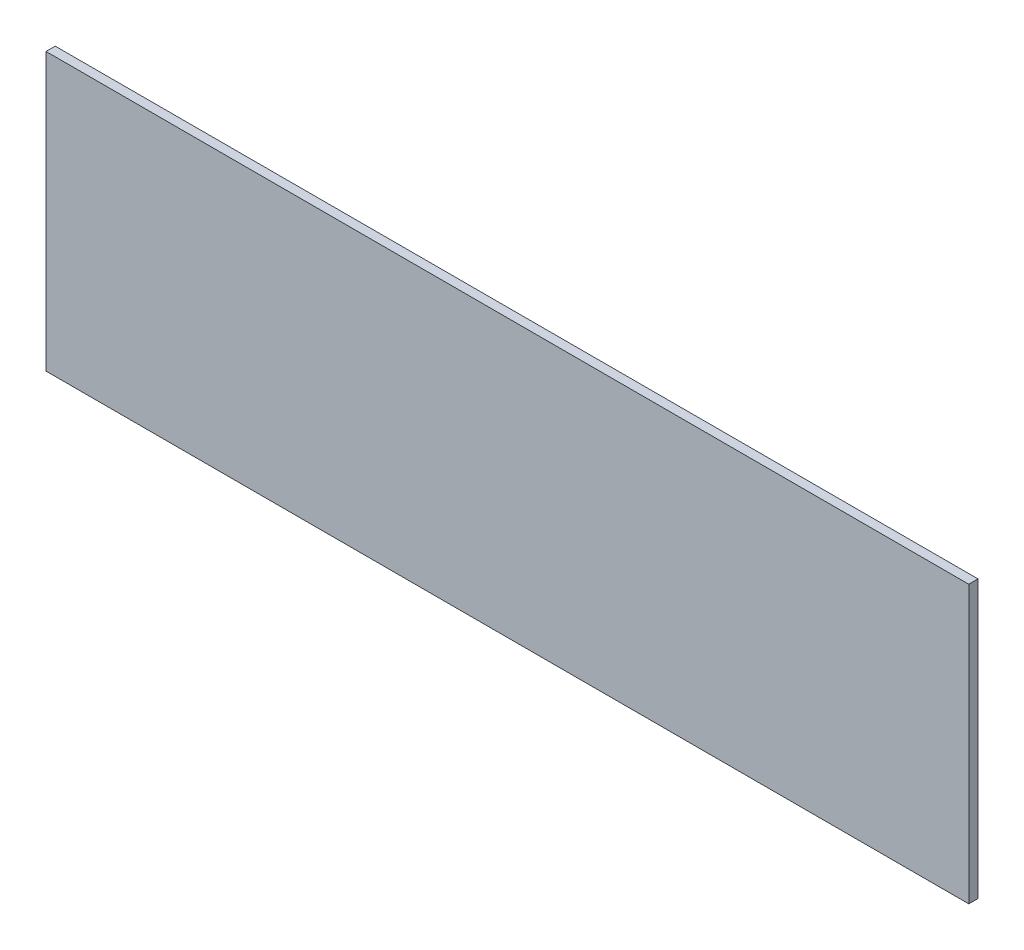
ISO-10303-21;
HEADER;
FILE_DESCRIPTION(('STEP AP214'),'2;1');
FILE_NAME('part.step','',(''),(''),'','','');
FILE_SCHEMA(('AUTOMOTIVE_DESIGN { 1 0 10303 214 1 1 1 1 }'));
ENDSEC;
DATA;
#1=APPLICATION_CONTEXT('core data for automotive mechanical design processes');
#2=APPLICATION_PROTOCOL_DEFINITION('international standard','automotive_design',2000,#1);
#3=PRODUCT_CONTEXT('',#1,'mechanical');
#4=PRODUCT('Part','Part','',(#3));
#5=PRODUCT_RELATED_PRODUCT_CATEGORY('part','',(#4));
#6=PRODUCT_DEFINITION_FORMATION('','',#4);
#7=PRODUCT_DEFINITION_CONTEXT('part definition',#1,'design');
#8=PRODUCT_DEFINITION('design','',#6,#7);
#9=PRODUCT_DEFINITION_SHAPE('','',#8);
#10=(LENGTH_UNIT() NAMED_UNIT(*) SI_UNIT(.MILLI.,.METRE.));
#11=(NAMED_UNIT(*) PLANE_ANGLE_UNIT() SI_UNIT($,.RADIAN.));
#12=(NAMED_UNIT(*) SI_UNIT($,.STERADIAN.) SOLID_ANGLE_UNIT());
#13=UNCERTAINTY_MEASURE_WITH_UNIT(LENGTH_MEASURE(1.E-05),#10,'distance_accuracy_value','');
#14=(GEOMETRIC_REPRESENTATION_CONTEXT(3) GLOBAL_UNCERTAINTY_ASSIGNED_CONTEXT((#13)) GLOBAL_UNIT_ASSIGNED_CONTEXT((#10,
#11,#12)) REPRESENTATION_CONTEXT('',''));
#15=CARTESIAN_POINT('',(0.,0.,0.));
#16=DIRECTION('',(0.,0.,1.));
#17=DIRECTION('',(1.,0.,0.));
#18=AXIS2_PLACEMENT_3D('',#15,#16,#17);
#19=CARTESIAN_POINT('',(0.,0.,5.));
#20=DIRECTION('',(1.,0.,0.));
#21=DIRECTION('',(0.,1.,0.));
#22=AXIS2_PLACEMENT_3D('',#19,#20,#21);
#23=PLANE('',#22);
#24=DIRECTION('',(0.,-1.,0.));
#25=VECTOR('',#24,1.);
#26=CARTESIAN_POINT('',(0.,0.,0.));
#27=LINE('',#26,#25);
#28=CARTESIAN_POINT('',(0.,0.,0.));
#29=VERTEX_POINT('',#28);
#30=CARTESIAN_POINT('',(0.,-150.,0.));
#31=VERTEX_POINT('',#30);
#32=EDGE_CURVE('E100',#29,#31,#27,.T.);
#33=ORIENTED_EDGE('',*,*,#32,.T.);
#34=DIRECTION('',(0.,0.,-1.));
#35=VECTOR('',#34,1.);
#36=CARTESIAN_POINT('',(0.,-150.,5.));
#37=LINE('',#36,#35);
#38=CARTESIAN_POINT('',(0.,-150.,5.));
#39=VERTEX_POINT('',#38);
#40=EDGE_CURVE('E11',#39,#31,#37,.T.);
#41=ORIENTED_EDGE('',*,*,#40,.F.);
#42=DIRECTION('',(0.,-1.,0.));
#43=VECTOR('',#42,1.);
#44=CARTESIAN_POINT('',(0.,0.,5.));
#45=LINE('',#44,#43);
#46=CARTESIAN_POINT('',(0.,0.,5.));
#47=VERTEX_POINT('',#46);
#48=EDGE_CURVE('E88',#47,#39,#45,.T.);
#49=ORIENTED_EDGE('',*,*,#48,.F.);
#50=DIRECTION('',(0.,0.,-1.));
#51=VECTOR('',#50,1.);
#52=CARTESIAN_POINT('',(0.,0.,5.));
#53=LINE('',#52,#51);
#54=EDGE_CURVE('E96',#47,#29,#53,.T.);
#55=ORIENTED_EDGE('',*,*,#54,.T.);
#56=EDGE_LOOP('',(#33,#41,#49,#55));
#57=FACE_BOUND('',#56,.T.);
#58=ADVANCED_FACE('F37',(#57),#23,.F.);
#59=CARTESIAN_POINT('',(0.,-150.,5.));
#60=DIRECTION('',(0.,1.,0.));
#61=DIRECTION('',(0.,0.,1.));
#62=AXIS2_PLACEMENT_3D('',#59,#60,#61);
#63=PLANE('',#62);
#64=DIRECTION('',(1.,0.,0.));
#65=VECTOR('',#64,1.);
#66=CARTESIAN_POINT('',(0.,-150.,0.));
#67=LINE('',#66,#65);
#68=CARTESIAN_POINT('',(500.,-150.,0.));
#69=VERTEX_POINT('',#68);
#70=EDGE_CURVE('E92',#31,#69,#67,.T.);
#71=ORIENTED_EDGE('',*,*,#70,.T.);
#72=DIRECTION('',(0.,0.,-1.));
#73=VECTOR('',#72,1.);
#74=CARTESIAN_POINT('',(500.,-150.,5.));
#75=LINE('',#74,#73);
#76=CARTESIAN_POINT('',(500.,-150.,5.));
#77=VERTEX_POINT('',#76);
#78=EDGE_CURVE('E45',#77,#69,#75,.T.);
#79=ORIENTED_EDGE('',*,*,#78,.F.);
#80=DIRECTION('',(1.,0.,0.));
#81=VECTOR('',#80,1.);
#82=CARTESIAN_POINT('',(0.,-150.,5.));
#83=LINE('',#82,#81);
#84=EDGE_CURVE('E83',#39,#77,#83,.T.);
#85=ORIENTED_EDGE('',*,*,#84,.F.);
#86=ORIENTED_EDGE('',*,*,#40,.T.);
#87=EDGE_LOOP('',(#71,#79,#85,#86));
#88=FACE_BOUND('',#87,.T.);
#89=ADVANCED_FACE('F91',(#88),#63,.F.);
#90=CARTESIAN_POINT('',(500.,0.,5.));
#91=DIRECTION('',(-1.,0.,0.));
#92=DIRECTION('',(0.,0.,1.));
#93=AXIS2_PLACEMENT_3D('',#90,#91,#92);
#94=PLANE('',#93);
#95=DIRECTION('',(0.,1.,0.));
#96=VECTOR('',#95,1.);
#97=CARTESIAN_POINT('',(500.,0.,0.));
#98=LINE('',#97,#96);
#99=CARTESIAN_POINT('',(500.,0.,0.));
#100=VERTEX_POINT('',#99);
#101=EDGE_CURVE('E70',#69,#100,#98,.T.);
#102=ORIENTED_EDGE('',*,*,#101,.T.);
#103=DIRECTION('',(0.,0.,-1.));
#104=VECTOR('',#103,1.);
#105=CARTESIAN_POINT('',(500.,0.,5.));
#106=LINE('',#105,#104);
#107=CARTESIAN_POINT('',(500.,0.,5.));
#108=VERTEX_POINT('',#107);
#109=EDGE_CURVE('E93',#108,#100,#106,.T.);
#110=ORIENTED_EDGE('',*,*,#109,.F.);
#111=DIRECTION('',(0.,1.,0.));
#112=VECTOR('',#111,1.);
#113=CARTESIAN_POINT('',(500.,0.,5.));
#114=LINE('',#113,#112);
#115=EDGE_CURVE('E86',#77,#108,#114,.T.);
#116=ORIENTED_EDGE('',*,*,#115,.F.);
#117=ORIENTED_EDGE('',*,*,#78,.T.);
#118=EDGE_LOOP('',(#102,#110,#116,#117));
#119=FACE_BOUND('',#118,.T.);
#120=ADVANCED_FACE('F94',(#119),#94,.F.);
#121=CARTESIAN_POINT('',(0.,0.,5.));
#122=DIRECTION('',(0.,-1.,0.));
#123=DIRECTION('',(0.,0.,-1.));
#124=AXIS2_PLACEMENT_3D('',#121,#122,#123);
#125=PLANE('',#124);
#126=DIRECTION('',(-1.,0.,0.));
#127=VECTOR('',#126,1.);
#128=CARTESIAN_POINT('',(0.,0.,0.));
#129=LINE('',#128,#127);
#130=EDGE_CURVE('E76',#100,#29,#129,.T.);
#131=ORIENTED_EDGE('',*,*,#130,.T.);
#132=ORIENTED_EDGE('',*,*,#54,.F.);
#133=DIRECTION('',(-1.,0.,0.));
#134=VECTOR('',#133,1.);
#135=CARTESIAN_POINT('',(0.,0.,5.));
#136=LINE('',#135,#134);
#137=EDGE_CURVE('E53',#108,#47,#136,.T.);
#138=ORIENTED_EDGE('',*,*,#137,.F.);
#139=ORIENTED_EDGE('',*,*,#109,.T.);
#140=EDGE_LOOP('',(#131,#132,#138,#139));
#141=FACE_BOUND('',#140,.T.);
#142=ADVANCED_FACE('F107',(#141),#125,.F.);
#143=CARTESIAN_POINT('',(0.,0.,5.));
#144=DIRECTION('',(0.,0.,1.));
#145=DIRECTION('',(1.,0.,0.));
#146=AXIS2_PLACEMENT_3D('',#143,#144,#145);
#147=PLANE('',#146);
#148=ORIENTED_EDGE('',*,*,#48,.T.);
#149=ORIENTED_EDGE('',*,*,#84,.T.);
#150=ORIENTED_EDGE('',*,*,#115,.T.);
#151=ORIENTED_EDGE('',*,*,#137,.T.);
#152=EDGE_LOOP('',(#148,#149,#150,#151));
#153=FACE_BOUND('',#152,.T.);
#154=ADVANCED_FACE('F84',(#153),#147,.T.);
#155=CARTESIAN_POINT('',(0.,0.,0.));
#156=DIRECTION('',(0.,0.,1.));
#157=DIRECTION('',(1.,0.,0.));
#158=AXIS2_PLACEMENT_3D('',#155,#156,#157);
#159=PLANE('',#158);
#160=ORIENTED_EDGE('',*,*,#32,.F.);
#161=ORIENTED_EDGE('',*,*,#130,.F.);
#162=ORIENTED_EDGE('',*,*,#101,.F.);
#163=ORIENTED_EDGE('',*,*,#70,.F.);
#164=EDGE_LOOP('',(#160,#161,#162,#163));
#165=FACE_BOUND('',#164,.T.);
#166=ADVANCED_FACE('F110',(#165),#159,.F.);
#167=CLOSED_SHELL('',(#58,#89,#120,#142,#154,#166));
#168=MANIFOLD_SOLID_BREP('B2',#167);
#169=ADVANCED_BREP_SHAPE_REPRESENTATION('',(#18,#168),#14);
#170=SHAPE_DEFINITION_REPRESENTATION(#9,#169);
ENDSEC;
END-ISO-10303-21;
